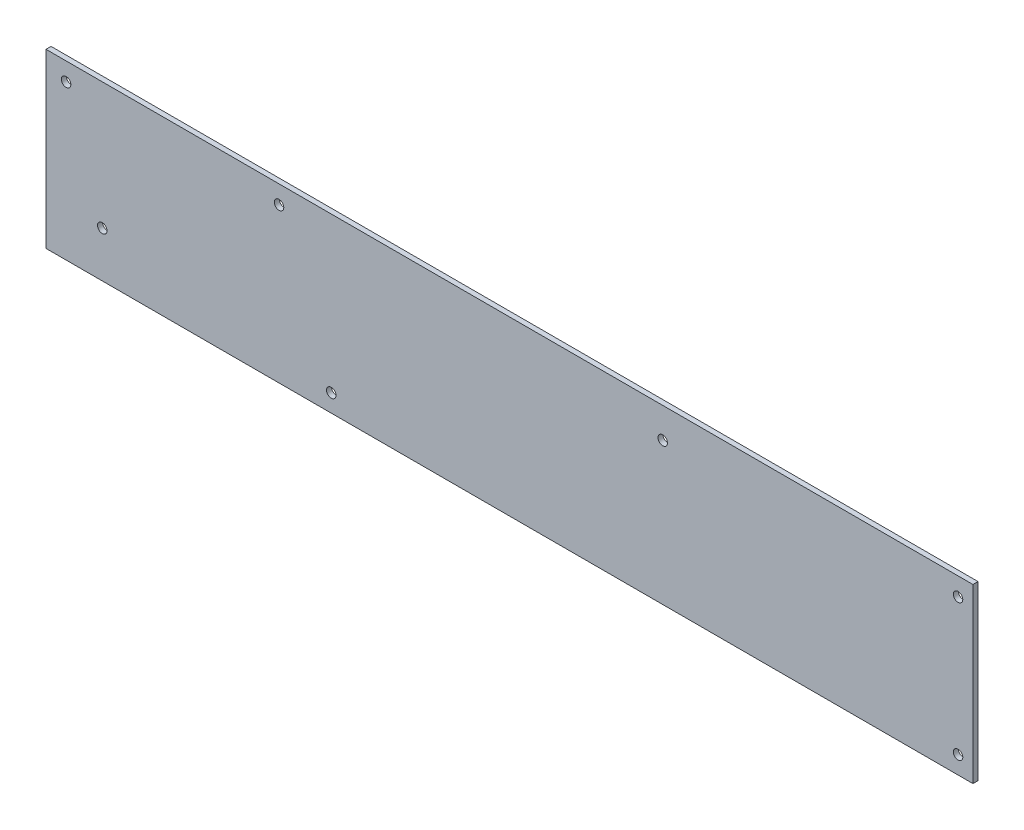
ISO-10303-21;
HEADER;
FILE_DESCRIPTION(('STEP AP214'),'2;1');
FILE_NAME('part.step','',(''),(''),'','','');
FILE_SCHEMA(('AUTOMOTIVE_DESIGN { 1 0 10303 214 1 1 1 1 }'));
ENDSEC;
DATA;
#1=APPLICATION_CONTEXT('core data for automotive mechanical design processes');
#2=APPLICATION_PROTOCOL_DEFINITION('international standard','automotive_design',2000,#1);
#3=PRODUCT_CONTEXT('',#1,'mechanical');
#4=PRODUCT('Part','Part','',(#3));
#5=PRODUCT_RELATED_PRODUCT_CATEGORY('part','',(#4));
#6=PRODUCT_DEFINITION_FORMATION('','',#4);
#7=PRODUCT_DEFINITION_CONTEXT('part definition',#1,'design');
#8=PRODUCT_DEFINITION('design','',#6,#7);
#9=PRODUCT_DEFINITION_SHAPE('','',#8);
#10=(LENGTH_UNIT() NAMED_UNIT(*) SI_UNIT(.MILLI.,.METRE.));
#11=(NAMED_UNIT(*) PLANE_ANGLE_UNIT() SI_UNIT($,.RADIAN.));
#12=(NAMED_UNIT(*) SI_UNIT($,.STERADIAN.) SOLID_ANGLE_UNIT());
#13=UNCERTAINTY_MEASURE_WITH_UNIT(LENGTH_MEASURE(1.E-05),#10,'distance_accuracy_value','');
#14=(GEOMETRIC_REPRESENTATION_CONTEXT(3) GLOBAL_UNCERTAINTY_ASSIGNED_CONTEXT((#13)) GLOBAL_UNIT_ASSIGNED_CONTEXT((#10,
#11,#12)) REPRESENTATION_CONTEXT('',''));
#15=CARTESIAN_POINT('',(0.,0.,0.));
#16=DIRECTION('',(0.,0.,1.));
#17=DIRECTION('',(1.,0.,0.));
#18=AXIS2_PLACEMENT_3D('',#15,#16,#17);
#19=CARTESIAN_POINT('',(-146.5,-27.26,1.6));
#20=DIRECTION('',(1.,0.,0.));
#21=DIRECTION('',(0.,0.,-1.));
#22=AXIS2_PLACEMENT_3D('',#19,#20,#21);
#23=PLANE('',#22);
#24=DIRECTION('',(0.,-1.,0.));
#25=VECTOR('',#24,1.);
#26=CARTESIAN_POINT('',(-146.5,-27.26,0.));
#27=LINE('',#26,#25);
#28=CARTESIAN_POINT('',(-146.5,27.26,0.));
#29=VERTEX_POINT('',#28);
#30=CARTESIAN_POINT('',(-146.5,-27.26,0.));
#31=VERTEX_POINT('',#30);
#32=EDGE_CURVE('E95',#29,#31,#27,.T.);
#33=ORIENTED_EDGE('',*,*,#32,.T.);
#34=DIRECTION('',(0.,0.,-1.));
#35=VECTOR('',#34,1.);
#36=CARTESIAN_POINT('',(-146.5,-27.26,1.6));
#37=LINE('',#36,#35);
#38=CARTESIAN_POINT('',(-146.5,-27.26,1.6));
#39=VERTEX_POINT('',#38);
#40=EDGE_CURVE('E11',#39,#31,#37,.T.);
#41=ORIENTED_EDGE('',*,*,#40,.F.);
#42=DIRECTION('',(0.,-1.,0.));
#43=VECTOR('',#42,1.);
#44=CARTESIAN_POINT('',(-146.5,-27.26,1.6));
#45=LINE('',#44,#43);
#46=CARTESIAN_POINT('',(-146.5,27.26,1.6));
#47=VERTEX_POINT('',#46);
#48=EDGE_CURVE('E83',#47,#39,#45,.T.);
#49=ORIENTED_EDGE('',*,*,#48,.F.);
#50=DIRECTION('',(0.,0.,-1.));
#51=VECTOR('',#50,1.);
#52=CARTESIAN_POINT('',(-146.5,27.26,1.6));
#53=LINE('',#52,#51);
#54=EDGE_CURVE('E91',#47,#29,#53,.T.);
#55=ORIENTED_EDGE('',*,*,#54,.T.);
#56=EDGE_LOOP('',(#33,#41,#49,#55));
#57=FACE_BOUND('',#56,.T.);
#58=ADVANCED_FACE('F32',(#57),#23,.F.);
#59=CARTESIAN_POINT('',(146.5,-27.26,1.6));
#60=DIRECTION('',(0.,1.,0.));
#61=DIRECTION('',(-1.,0.,0.));
#62=AXIS2_PLACEMENT_3D('',#59,#60,#61);
#63=PLANE('',#62);
#64=DIRECTION('',(1.,0.,0.));
#65=VECTOR('',#64,1.);
#66=CARTESIAN_POINT('',(146.5,-27.26,0.));
#67=LINE('',#66,#65);
#68=CARTESIAN_POINT('',(146.5,-27.26,0.));
#69=VERTEX_POINT('',#68);
#70=EDGE_CURVE('E87',#31,#69,#67,.T.);
#71=ORIENTED_EDGE('',*,*,#70,.T.);
#72=DIRECTION('',(0.,0.,-1.));
#73=VECTOR('',#72,1.);
#74=CARTESIAN_POINT('',(146.5,-27.26,1.6));
#75=LINE('',#74,#73);
#76=CARTESIAN_POINT('',(146.5,-27.26,1.6));
#77=VERTEX_POINT('',#76);
#78=EDGE_CURVE('E40',#77,#69,#75,.T.);
#79=ORIENTED_EDGE('',*,*,#78,.F.);
#80=DIRECTION('',(1.,0.,0.));
#81=VECTOR('',#80,1.);
#82=CARTESIAN_POINT('',(146.5,-27.26,1.6));
#83=LINE('',#82,#81);
#84=EDGE_CURVE('E78',#39,#77,#83,.T.);
#85=ORIENTED_EDGE('',*,*,#84,.F.);
#86=ORIENTED_EDGE('',*,*,#40,.T.);
#87=EDGE_LOOP('',(#71,#79,#85,#86));
#88=FACE_BOUND('',#87,.T.);
#89=ADVANCED_FACE('F86',(#88),#63,.F.);
#90=CARTESIAN_POINT('',(146.5,-27.26,1.6));
#91=DIRECTION('',(-1.,0.,0.));
#92=DIRECTION('',(0.,0.,1.));
#93=AXIS2_PLACEMENT_3D('',#90,#91,#92);
#94=PLANE('',#93);
#95=DIRECTION('',(0.,1.,0.));
#96=VECTOR('',#95,1.);
#97=CARTESIAN_POINT('',(146.5,-27.26,0.));
#98=LINE('',#97,#96);
#99=CARTESIAN_POINT('',(146.5,27.26,0.));
#100=VERTEX_POINT('',#99);
#101=EDGE_CURVE('E65',#69,#100,#98,.T.);
#102=ORIENTED_EDGE('',*,*,#101,.T.);
#103=DIRECTION('',(0.,0.,-1.));
#104=VECTOR('',#103,1.);
#105=CARTESIAN_POINT('',(146.5,27.26,1.6));
#106=LINE('',#105,#104);
#107=CARTESIAN_POINT('',(146.5,27.26,1.6));
#108=VERTEX_POINT('',#107);
#109=EDGE_CURVE('E88',#108,#100,#106,.T.);
#110=ORIENTED_EDGE('',*,*,#109,.F.);
#111=DIRECTION('',(0.,1.,0.));
#112=VECTOR('',#111,1.);
#113=CARTESIAN_POINT('',(146.5,-27.26,1.6));
#114=LINE('',#113,#112);
#115=EDGE_CURVE('E81',#77,#108,#114,.T.);
#116=ORIENTED_EDGE('',*,*,#115,.F.);
#117=ORIENTED_EDGE('',*,*,#78,.T.);
#118=EDGE_LOOP('',(#102,#110,#116,#117));
#119=FACE_BOUND('',#118,.T.);
#120=ADVANCED_FACE('F89',(#119),#94,.F.);
#121=CARTESIAN_POINT('',(146.5,27.26,1.6));
#122=DIRECTION('',(0.,-1.,0.));
#123=DIRECTION('',(1.,0.,0.));
#124=AXIS2_PLACEMENT_3D('',#121,#122,#123);
#125=PLANE('',#124);
#126=DIRECTION('',(-1.,0.,0.));
#127=VECTOR('',#126,1.);
#128=CARTESIAN_POINT('',(146.5,27.26,0.));
#129=LINE('',#128,#127);
#130=EDGE_CURVE('E71',#100,#29,#129,.T.);
#131=ORIENTED_EDGE('',*,*,#130,.T.);
#132=ORIENTED_EDGE('',*,*,#54,.F.);
#133=DIRECTION('',(-1.,0.,0.));
#134=VECTOR('',#133,1.);
#135=CARTESIAN_POINT('',(146.5,27.26,1.6));
#136=LINE('',#135,#134);
#137=EDGE_CURVE('E48',#108,#47,#136,.T.);
#138=ORIENTED_EDGE('',*,*,#137,.F.);
#139=ORIENTED_EDGE('',*,*,#109,.T.);
#140=EDGE_LOOP('',(#131,#132,#138,#139));
#141=FACE_BOUND('',#140,.T.);
#142=ADVANCED_FACE('F103',(#141),#125,.F.);
#143=CARTESIAN_POINT('',(0.,0.,1.6));
#144=DIRECTION('',(0.,0.,1.));
#145=DIRECTION('',(1.,0.,0.));
#146=AXIS2_PLACEMENT_3D('',#143,#144,#145);
#147=PLANE('',#146);
#148=CARTESIAN_POINT('',(141.79,-21.672,1.6));
#149=DIRECTION('',(0.,0.,1.));
#150=DIRECTION('',(1.,0.,0.));
#151=AXIS2_PLACEMENT_3D('',#148,#149,#150);
#152=CIRCLE('',#151,1.5);
#153=CARTESIAN_POINT('',(143.29,-21.672,1.6));
#154=VERTEX_POINT('',#153);
#155=EDGE_CURVE('E145',#154,#154,#152,.T.);
#156=ORIENTED_EDGE('',*,*,#155,.F.);
#157=EDGE_LOOP('',(#156));
#158=FACE_BOUND('',#157,.T.);
#159=CARTESIAN_POINT('',(-56.33,-21.672,1.6));
#160=DIRECTION('',(0.,0.,1.));
#161=DIRECTION('',(1.,0.,0.));
#162=AXIS2_PLACEMENT_3D('',#159,#160,#161);
#163=CIRCLE('',#162,1.5);
#164=CARTESIAN_POINT('',(-54.83,-21.672,1.6));
#165=VERTEX_POINT('',#164);
#166=EDGE_CURVE('E139',#165,#165,#163,.T.);
#167=ORIENTED_EDGE('',*,*,#166,.F.);
#168=EDGE_LOOP('',(#167));
#169=FACE_BOUND('',#168,.T.);
#170=CARTESIAN_POINT('',(141.79,21.508,1.6));
#171=DIRECTION('',(0.,0.,1.));
#172=DIRECTION('',(1.,0.,0.));
#173=AXIS2_PLACEMENT_3D('',#170,#171,#172);
#174=CIRCLE('',#173,1.5);
#175=CARTESIAN_POINT('',(143.29,21.508,1.6));
#176=VERTEX_POINT('',#175);
#177=EDGE_CURVE('E133',#176,#176,#174,.T.);
#178=ORIENTED_EDGE('',*,*,#177,.F.);
#179=EDGE_LOOP('',(#178));
#180=FACE_BOUND('',#179,.T.);
#181=CARTESIAN_POINT('',(48.445,17.698,1.6));
#182=DIRECTION('',(0.,0.,1.));
#183=DIRECTION('',(1.,0.,0.));
#184=AXIS2_PLACEMENT_3D('',#181,#182,#183);
#185=CIRCLE('',#184,1.5);
#186=CARTESIAN_POINT('',(49.945,17.698,1.6));
#187=VERTEX_POINT('',#186);
#188=EDGE_CURVE('E127',#187,#187,#185,.T.);
#189=ORIENTED_EDGE('',*,*,#188,.F.);
#190=EDGE_LOOP('',(#189));
#191=FACE_BOUND('',#190,.T.);
#192=CARTESIAN_POINT('',(-72.84,21.508,1.6));
#193=DIRECTION('',(0.,0.,1.));
#194=DIRECTION('',(1.,0.,0.));
#195=AXIS2_PLACEMENT_3D('',#192,#193,#194);
#196=CIRCLE('',#195,1.5);
#197=CARTESIAN_POINT('',(-71.34,21.508,1.6));
#198=VERTEX_POINT('',#197);
#199=EDGE_CURVE('E121',#198,#198,#196,.T.);
#200=ORIENTED_EDGE('',*,*,#199,.F.);
#201=EDGE_LOOP('',(#200));
#202=FACE_BOUND('',#201,.T.);
#203=CARTESIAN_POINT('',(-128.72,-12.782,1.6));
#204=DIRECTION('',(0.,0.,1.));
#205=DIRECTION('',(1.,0.,0.));
#206=AXIS2_PLACEMENT_3D('',#203,#204,#205);
#207=CIRCLE('',#206,1.5);
#208=CARTESIAN_POINT('',(-127.22,-12.782,1.6));
#209=VERTEX_POINT('',#208);
#210=EDGE_CURVE('E115',#209,#209,#207,.T.);
#211=ORIENTED_EDGE('',*,*,#210,.F.);
#212=EDGE_LOOP('',(#211));
#213=FACE_BOUND('',#212,.T.);
#214=CARTESIAN_POINT('',(-140.15,21.508,1.6));
#215=DIRECTION('',(0.,0.,1.));
#216=DIRECTION('',(1.,0.,0.));
#217=AXIS2_PLACEMENT_3D('',#214,#215,#216);
#218=CIRCLE('',#217,1.5);
#219=CARTESIAN_POINT('',(-138.65,21.508,1.6));
#220=VERTEX_POINT('',#219);
#221=EDGE_CURVE('E109',#220,#220,#218,.T.);
#222=ORIENTED_EDGE('',*,*,#221,.F.);
#223=EDGE_LOOP('',(#222));
#224=FACE_BOUND('',#223,.T.);
#225=ORIENTED_EDGE('',*,*,#48,.T.);
#226=ORIENTED_EDGE('',*,*,#84,.T.);
#227=ORIENTED_EDGE('',*,*,#115,.T.);
#228=ORIENTED_EDGE('',*,*,#137,.T.);
#229=EDGE_LOOP('',(#225,#226,#227,#228));
#230=FACE_BOUND('',#229,.T.);
#231=ADVANCED_FACE('F79',(#158,#169,#180,#191,#202,#213,#224,#230),#147,.T.);
#232=CARTESIAN_POINT('',(0.,0.,0.));
#233=DIRECTION('',(0.,0.,1.));
#234=DIRECTION('',(1.,0.,0.));
#235=AXIS2_PLACEMENT_3D('',#232,#233,#234);
#236=PLANE('',#235);
#237=CARTESIAN_POINT('',(141.79,-21.672,0.));
#238=DIRECTION('',(0.,0.,1.));
#239=DIRECTION('',(1.,0.,0.));
#240=AXIS2_PLACEMENT_3D('',#237,#238,#239);
#241=CIRCLE('',#240,1.5);
#242=CARTESIAN_POINT('',(143.29,-21.672,0.));
#243=VERTEX_POINT('',#242);
#244=EDGE_CURVE('E142',#243,#243,#241,.T.);
#245=ORIENTED_EDGE('',*,*,#244,.T.);
#246=EDGE_LOOP('',(#245));
#247=FACE_BOUND('',#246,.T.);
#248=CARTESIAN_POINT('',(-56.33,-21.672,0.));
#249=DIRECTION('',(0.,0.,1.));
#250=DIRECTION('',(1.,0.,0.));
#251=AXIS2_PLACEMENT_3D('',#248,#249,#250);
#252=CIRCLE('',#251,1.5);
#253=CARTESIAN_POINT('',(-54.83,-21.672,0.));
#254=VERTEX_POINT('',#253);
#255=EDGE_CURVE('E136',#254,#254,#252,.T.);
#256=ORIENTED_EDGE('',*,*,#255,.T.);
#257=EDGE_LOOP('',(#256));
#258=FACE_BOUND('',#257,.T.);
#259=CARTESIAN_POINT('',(141.79,21.508,0.));
#260=DIRECTION('',(0.,0.,1.));
#261=DIRECTION('',(1.,0.,0.));
#262=AXIS2_PLACEMENT_3D('',#259,#260,#261);
#263=CIRCLE('',#262,1.5);
#264=CARTESIAN_POINT('',(143.29,21.508,0.));
#265=VERTEX_POINT('',#264);
#266=EDGE_CURVE('E130',#265,#265,#263,.T.);
#267=ORIENTED_EDGE('',*,*,#266,.T.);
#268=EDGE_LOOP('',(#267));
#269=FACE_BOUND('',#268,.T.);
#270=CARTESIAN_POINT('',(48.445,17.698,0.));
#271=DIRECTION('',(0.,0.,1.));
#272=DIRECTION('',(1.,0.,0.));
#273=AXIS2_PLACEMENT_3D('',#270,#271,#272);
#274=CIRCLE('',#273,1.5);
#275=CARTESIAN_POINT('',(49.945,17.698,0.));
#276=VERTEX_POINT('',#275);
#277=EDGE_CURVE('E124',#276,#276,#274,.T.);
#278=ORIENTED_EDGE('',*,*,#277,.T.);
#279=EDGE_LOOP('',(#278));
#280=FACE_BOUND('',#279,.T.);
#281=CARTESIAN_POINT('',(-72.84,21.508,0.));
#282=DIRECTION('',(0.,0.,1.));
#283=DIRECTION('',(1.,0.,0.));
#284=AXIS2_PLACEMENT_3D('',#281,#282,#283);
#285=CIRCLE('',#284,1.5);
#286=CARTESIAN_POINT('',(-71.34,21.508,0.));
#287=VERTEX_POINT('',#286);
#288=EDGE_CURVE('E118',#287,#287,#285,.T.);
#289=ORIENTED_EDGE('',*,*,#288,.T.);
#290=EDGE_LOOP('',(#289));
#291=FACE_BOUND('',#290,.T.);
#292=CARTESIAN_POINT('',(-128.72,-12.782,0.));
#293=DIRECTION('',(0.,0.,1.));
#294=DIRECTION('',(1.,0.,0.));
#295=AXIS2_PLACEMENT_3D('',#292,#293,#294);
#296=CIRCLE('',#295,1.5);
#297=CARTESIAN_POINT('',(-127.22,-12.782,0.));
#298=VERTEX_POINT('',#297);
#299=EDGE_CURVE('E112',#298,#298,#296,.T.);
#300=ORIENTED_EDGE('',*,*,#299,.T.);
#301=EDGE_LOOP('',(#300));
#302=FACE_BOUND('',#301,.T.);
#303=CARTESIAN_POINT('',(-140.15,21.508,0.));
#304=DIRECTION('',(0.,0.,1.));
#305=DIRECTION('',(1.,0.,0.));
#306=AXIS2_PLACEMENT_3D('',#303,#304,#305);
#307=CIRCLE('',#306,1.5);
#308=CARTESIAN_POINT('',(-138.65,21.508,0.));
#309=VERTEX_POINT('',#308);
#310=EDGE_CURVE('E98',#309,#309,#307,.T.);
#311=ORIENTED_EDGE('',*,*,#310,.T.);
#312=EDGE_LOOP('',(#311));
#313=FACE_BOUND('',#312,.T.);
#314=ORIENTED_EDGE('',*,*,#32,.F.);
#315=ORIENTED_EDGE('',*,*,#130,.F.);
#316=ORIENTED_EDGE('',*,*,#101,.F.);
#317=ORIENTED_EDGE('',*,*,#70,.F.);
#318=EDGE_LOOP('',(#314,#315,#316,#317));
#319=FACE_BOUND('',#318,.T.);
#320=ADVANCED_FACE('F106',(#247,#258,#269,#280,#291,#302,#313,#319),#236,.F.);
#321=CARTESIAN_POINT('',(-140.15,21.508,0.));
#322=DIRECTION('',(0.,0.,1.));
#323=DIRECTION('',(1.,0.,0.));
#324=AXIS2_PLACEMENT_3D('',#321,#322,#323);
#325=CYLINDRICAL_SURFACE('',#324,1.5);
#326=ORIENTED_EDGE('',*,*,#310,.F.);
#327=EDGE_LOOP('',(#326));
#328=FACE_BOUND('',#327,.T.);
#329=ORIENTED_EDGE('',*,*,#221,.T.);
#330=EDGE_LOOP('',(#329));
#331=FACE_BOUND('',#330,.T.);
#332=ADVANCED_FACE('F175',(#328,#331),#325,.F.);
#333=CARTESIAN_POINT('',(-128.72,-12.782,0.));
#334=DIRECTION('',(0.,0.,1.));
#335=DIRECTION('',(1.,0.,0.));
#336=AXIS2_PLACEMENT_3D('',#333,#334,#335);
#337=CYLINDRICAL_SURFACE('',#336,1.5);
#338=ORIENTED_EDGE('',*,*,#299,.F.);
#339=EDGE_LOOP('',(#338));
#340=FACE_BOUND('',#339,.T.);
#341=ORIENTED_EDGE('',*,*,#210,.T.);
#342=EDGE_LOOP('',(#341));
#343=FACE_BOUND('',#342,.T.);
#344=ADVANCED_FACE('F177',(#340,#343),#337,.F.);
#345=CARTESIAN_POINT('',(-72.84,21.508,0.));
#346=DIRECTION('',(0.,0.,1.));
#347=DIRECTION('',(1.,0.,0.));
#348=AXIS2_PLACEMENT_3D('',#345,#346,#347);
#349=CYLINDRICAL_SURFACE('',#348,1.5);
#350=ORIENTED_EDGE('',*,*,#288,.F.);
#351=EDGE_LOOP('',(#350));
#352=FACE_BOUND('',#351,.T.);
#353=ORIENTED_EDGE('',*,*,#199,.T.);
#354=EDGE_LOOP('',(#353));
#355=FACE_BOUND('',#354,.T.);
#356=ADVANCED_FACE('F184',(#352,#355),#349,.F.);
#357=CARTESIAN_POINT('',(48.445,17.698,0.));
#358=DIRECTION('',(0.,0.,1.));
#359=DIRECTION('',(1.,0.,0.));
#360=AXIS2_PLACEMENT_3D('',#357,#358,#359);
#361=CYLINDRICAL_SURFACE('',#360,1.5);
#362=ORIENTED_EDGE('',*,*,#277,.F.);
#363=EDGE_LOOP('',(#362));
#364=FACE_BOUND('',#363,.T.);
#365=ORIENTED_EDGE('',*,*,#188,.T.);
#366=EDGE_LOOP('',(#365));
#367=FACE_BOUND('',#366,.T.);
#368=ADVANCED_FACE('F232',(#364,#367),#361,.F.);
#369=CARTESIAN_POINT('',(141.79,21.508,0.));
#370=DIRECTION('',(0.,0.,1.));
#371=DIRECTION('',(1.,0.,0.));
#372=AXIS2_PLACEMENT_3D('',#369,#370,#371);
#373=CYLINDRICAL_SURFACE('',#372,1.5);
#374=ORIENTED_EDGE('',*,*,#266,.F.);
#375=EDGE_LOOP('',(#374));
#376=FACE_BOUND('',#375,.T.);
#377=ORIENTED_EDGE('',*,*,#177,.T.);
#378=EDGE_LOOP('',(#377));
#379=FACE_BOUND('',#378,.T.);
#380=ADVANCED_FACE('F242',(#376,#379),#373,.F.);
#381=CARTESIAN_POINT('',(-56.33,-21.672,0.));
#382=DIRECTION('',(0.,0.,1.));
#383=DIRECTION('',(1.,0.,0.));
#384=AXIS2_PLACEMENT_3D('',#381,#382,#383);
#385=CYLINDRICAL_SURFACE('',#384,1.5);
#386=ORIENTED_EDGE('',*,*,#255,.F.);
#387=EDGE_LOOP('',(#386));
#388=FACE_BOUND('',#387,.T.);
#389=ORIENTED_EDGE('',*,*,#166,.T.);
#390=EDGE_LOOP('',(#389));
#391=FACE_BOUND('',#390,.T.);
#392=ADVANCED_FACE('F156',(#388,#391),#385,.F.);
#393=CARTESIAN_POINT('',(141.79,-21.672,0.));
#394=DIRECTION('',(0.,0.,1.));
#395=DIRECTION('',(1.,0.,0.));
#396=AXIS2_PLACEMENT_3D('',#393,#394,#395);
#397=CYLINDRICAL_SURFACE('',#396,1.5);
#398=ORIENTED_EDGE('',*,*,#244,.F.);
#399=EDGE_LOOP('',(#398));
#400=FACE_BOUND('',#399,.T.);
#401=ORIENTED_EDGE('',*,*,#155,.T.);
#402=EDGE_LOOP('',(#401));
#403=FACE_BOUND('',#402,.T.);
#404=ADVANCED_FACE('F153',(#400,#403),#397,.F.);
#405=CLOSED_SHELL('',(#58,#89,#120,#142,#231,#320,#332,#344,#356,#368,#380,#392,#404));
#406=MANIFOLD_SOLID_BREP('B2',#405);
#407=ADVANCED_BREP_SHAPE_REPRESENTATION('',(#18,#406),#14);
#408=SHAPE_DEFINITION_REPRESENTATION(#9,#407);
ENDSEC;
END-ISO-10303-21;
